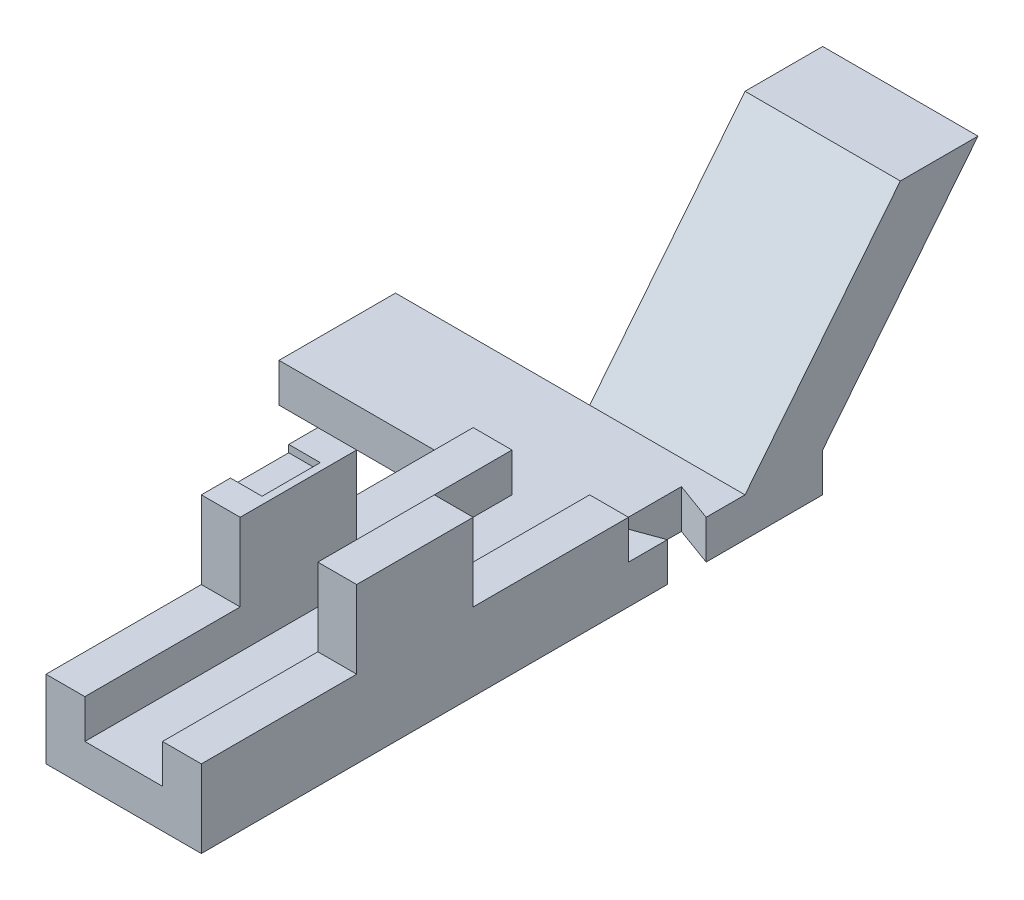
ISO-10303-21;
HEADER;
FILE_DESCRIPTION(('STEP AP214'),'2;1');
FILE_NAME('part.step','',(''),(''),'','','');
FILE_SCHEMA(('AUTOMOTIVE_DESIGN { 1 0 10303 214 1 1 1 1 }'));
ENDSEC;
DATA;
#1=APPLICATION_CONTEXT('core data for automotive mechanical design processes');
#2=APPLICATION_PROTOCOL_DEFINITION('international standard','automotive_design',2000,#1);
#3=PRODUCT_CONTEXT('',#1,'mechanical');
#4=PRODUCT('Part','Part','',(#3));
#5=PRODUCT_RELATED_PRODUCT_CATEGORY('part','',(#4));
#6=PRODUCT_DEFINITION_FORMATION('','',#4);
#7=PRODUCT_DEFINITION_CONTEXT('part definition',#1,'design');
#8=PRODUCT_DEFINITION('design','',#6,#7);
#9=PRODUCT_DEFINITION_SHAPE('','',#8);
#10=(LENGTH_UNIT() NAMED_UNIT(*) SI_UNIT(.MILLI.,.METRE.));
#11=(NAMED_UNIT(*) PLANE_ANGLE_UNIT() SI_UNIT($,.RADIAN.));
#12=(NAMED_UNIT(*) SI_UNIT($,.STERADIAN.) SOLID_ANGLE_UNIT());
#13=UNCERTAINTY_MEASURE_WITH_UNIT(LENGTH_MEASURE(1.E-05),#10,'distance_accuracy_value','');
#14=(GEOMETRIC_REPRESENTATION_CONTEXT(3) GLOBAL_UNCERTAINTY_ASSIGNED_CONTEXT((#13)) GLOBAL_UNIT_ASSIGNED_CONTEXT((#10,
#11,#12)) REPRESENTATION_CONTEXT('',''));
#15=CARTESIAN_POINT('',(0.,0.,0.));
#16=DIRECTION('',(0.,0.,1.));
#17=DIRECTION('',(1.,0.,0.));
#18=AXIS2_PLACEMENT_3D('',#15,#16,#17);
#19=CARTESIAN_POINT('',(101.6,25.4,0.));
#20=DIRECTION('',(-1.,0.,0.));
#21=DIRECTION('',(0.,0.,1.));
#22=AXIS2_PLACEMENT_3D('',#19,#20,#21);
#23=PLANE('',#22);
#24=DIRECTION('',(0.,0.,-1.));
#25=VECTOR('',#24,1.);
#26=CARTESIAN_POINT('',(101.6,0.,0.));
#27=LINE('',#26,#25);
#28=CARTESIAN_POINT('',(101.6,0.,0.));
#29=VERTEX_POINT('',#28);
#30=CARTESIAN_POINT('',(101.6,0.,-304.8));
#31=VERTEX_POINT('',#30);
#32=EDGE_CURVE('E501',#29,#31,#27,.T.);
#33=ORIENTED_EDGE('',*,*,#32,.T.);
#34=DIRECTION('',(0.,1.,0.));
#35=VECTOR('',#34,1.);
#36=CARTESIAN_POINT('',(101.6,-2.50000000007189E-05,-304.8));
#37=LINE('',#36,#35);
#38=CARTESIAN_POINT('',(101.6,25.4,-304.8));
#39=VERTEX_POINT('',#38);
#40=EDGE_CURVE('E342',#31,#39,#37,.T.);
#41=ORIENTED_EDGE('',*,*,#40,.T.);
#42=DIRECTION('',(0.,0.,-1.));
#43=VECTOR('',#42,1.);
#44=CARTESIAN_POINT('',(101.6,25.4,0.));
#45=LINE('',#44,#43);
#46=CARTESIAN_POINT('',(101.6,25.4,-279.4));
#47=VERTEX_POINT('',#46);
#48=EDGE_CURVE('E492',#47,#39,#45,.T.);
#49=ORIENTED_EDGE('',*,*,#48,.F.);
#50=DIRECTION('',(0.,-1.,0.));
#51=VECTOR('',#50,1.);
#52=CARTESIAN_POINT('',(101.6,50.8,-279.4));
#53=LINE('',#52,#51);
#54=CARTESIAN_POINT('',(101.6,50.8,-279.4));
#55=VERTEX_POINT('',#54);
#56=EDGE_CURVE('E606',#55,#47,#53,.T.);
#57=ORIENTED_EDGE('',*,*,#56,.F.);
#58=DIRECTION('',(0.,0.,1.));
#59=VECTOR('',#58,1.);
#60=CARTESIAN_POINT('',(101.6,50.8,-279.4));
#61=LINE('',#60,#59);
#62=CARTESIAN_POINT('',(101.6,50.8,-177.8));
#63=VERTEX_POINT('',#62);
#64=EDGE_CURVE('E597',#55,#63,#61,.T.);
#65=ORIENTED_EDGE('',*,*,#64,.T.);
#66=DIRECTION('',(0.,-1.,0.));
#67=VECTOR('',#66,1.);
#68=CARTESIAN_POINT('',(101.6,101.6,-177.8));
#69=LINE('',#68,#67);
#70=CARTESIAN_POINT('',(101.6,101.6,-177.8));
#71=VERTEX_POINT('',#70);
#72=EDGE_CURVE('E558',#71,#63,#69,.T.);
#73=ORIENTED_EDGE('',*,*,#72,.F.);
#74=DIRECTION('',(0.,0.,-1.));
#75=VECTOR('',#74,1.);
#76=CARTESIAN_POINT('',(101.6,101.6,-177.8));
#77=LINE('',#76,#75);
#78=CARTESIAN_POINT('',(101.6,101.6,-101.6));
#79=VERTEX_POINT('',#78);
#80=EDGE_CURVE('E547',#79,#71,#77,.T.);
#81=ORIENTED_EDGE('',*,*,#80,.F.);
#82=DIRECTION('',(0.,-1.,0.));
#83=VECTOR('',#82,1.);
#84=CARTESIAN_POINT('',(101.6,101.6,-101.6));
#85=LINE('',#84,#83);
#86=CARTESIAN_POINT('',(101.6,50.8,-101.6));
#87=VERTEX_POINT('',#86);
#88=EDGE_CURVE('E561',#79,#87,#85,.T.);
#89=ORIENTED_EDGE('',*,*,#88,.T.);
#90=CARTESIAN_POINT('',(101.6,50.8,0.));
#91=VERTEX_POINT('',#90);
#92=EDGE_CURVE('E595',#87,#91,#61,.T.);
#93=ORIENTED_EDGE('',*,*,#92,.T.);
#94=DIRECTION('',(0.,-1.,0.));
#95=VECTOR('',#94,1.);
#96=CARTESIAN_POINT('',(101.6,25.4,0.));
#97=LINE('',#96,#95);
#98=EDGE_CURVE('E515',#91,#29,#97,.T.);
#99=ORIENTED_EDGE('',*,*,#98,.T.);
#100=EDGE_LOOP('',(#33,#41,#49,#57,#65,#73,#81,#89,#93,#99));
#101=FACE_BOUND('',#100,.T.);
#102=ADVANCED_FACE('F90',(#101),#23,.F.);
#103=CARTESIAN_POINT('',(0.,25.4,-355.6));
#104=DIRECTION('',(0.,0.,1.));
#105=DIRECTION('',(1.,0.,0.));
#106=AXIS2_PLACEMENT_3D('',#103,#104,#105);
#107=PLANE('',#106);
#108=DIRECTION('',(0.,1.,0.));
#109=VECTOR('',#108,1.);
#110=CARTESIAN_POINT('',(0.,25.4,-355.6));
#111=LINE('',#110,#109);
#112=CARTESIAN_POINT('',(0.,0.,-355.6));
#113=VERTEX_POINT('',#112);
#114=CARTESIAN_POINT('',(0.,25.4,-355.6));
#115=VERTEX_POINT('',#114);
#116=EDGE_CURVE('E453',#113,#115,#111,.T.);
#117=ORIENTED_EDGE('',*,*,#116,.F.);
#118=DIRECTION('',(-1.,0.,0.));
#119=VECTOR('',#118,1.);
#120=CARTESIAN_POINT('',(0.,0.,-355.6));
#121=LINE('',#120,#119);
#122=CARTESIAN_POINT('',(-127.,0.,-355.6));
#123=VERTEX_POINT('',#122);
#124=EDGE_CURVE('E497',#113,#123,#121,.T.);
#125=ORIENTED_EDGE('',*,*,#124,.T.);
#126=DIRECTION('',(0.,-1.,0.));
#127=VECTOR('',#126,1.);
#128=CARTESIAN_POINT('',(-127.,25.4,-355.6));
#129=LINE('',#128,#127);
#130=CARTESIAN_POINT('',(-127.,25.4,-355.6));
#131=VERTEX_POINT('',#130);
#132=EDGE_CURVE('E654',#131,#123,#129,.T.);
#133=ORIENTED_EDGE('',*,*,#132,.F.);
#134=DIRECTION('',(-1.,0.,0.));
#135=VECTOR('',#134,1.);
#136=CARTESIAN_POINT('',(0.,25.4,-355.6));
#137=LINE('',#136,#135);
#138=EDGE_CURVE('E495',#115,#131,#137,.T.);
#139=ORIENTED_EDGE('',*,*,#138,.F.);
#140=EDGE_LOOP('',(#117,#125,#133,#139));
#141=FACE_BOUND('',#140,.T.);
#142=ADVANCED_FACE('F724',(#141),#107,.F.);
#143=CARTESIAN_POINT('',(0.,50.8,0.));
#144=DIRECTION('',(0.,-1.,0.));
#145=DIRECTION('',(0.,0.,-1.));
#146=AXIS2_PLACEMENT_3D('',#143,#144,#145);
#147=PLANE('',#146);
#148=DIRECTION('',(1.,0.,0.));
#149=VECTOR('',#148,1.);
#150=CARTESIAN_POINT('',(76.2,50.8,-101.6));
#151=LINE('',#150,#149);
#152=CARTESIAN_POINT('',(76.2,50.8,-101.6));
#153=VERTEX_POINT('',#152);
#154=EDGE_CURVE('E540',#153,#87,#151,.T.);
#155=ORIENTED_EDGE('',*,*,#154,.F.);
#156=DIRECTION('',(0.,0.,1.));
#157=VECTOR('',#156,1.);
#158=CARTESIAN_POINT('',(76.2,50.8,-279.4));
#159=LINE('',#158,#157);
#160=CARTESIAN_POINT('',(76.2,50.8,0.));
#161=VERTEX_POINT('',#160);
#162=EDGE_CURVE('E603',#153,#161,#159,.T.);
#163=ORIENTED_EDGE('',*,*,#162,.T.);
#164=DIRECTION('',(1.,0.,0.));
#165=VECTOR('',#164,1.);
#166=CARTESIAN_POINT('',(76.2,50.8,0.));
#167=LINE('',#166,#165);
#168=EDGE_CURVE('E600',#161,#91,#167,.T.);
#169=ORIENTED_EDGE('',*,*,#168,.T.);
#170=ORIENTED_EDGE('',*,*,#92,.F.);
#171=EDGE_LOOP('',(#155,#163,#169,#170));
#172=FACE_BOUND('',#171,.T.);
#173=ADVANCED_FACE('F722',(#172),#147,.F.);
#174=DIRECTION('',(-1.,0.,0.));
#175=VECTOR('',#174,1.);
#176=CARTESIAN_POINT('',(76.2,50.8,-177.8));
#177=LINE('',#176,#175);
#178=CARTESIAN_POINT('',(76.2,50.8,-177.8));
#179=VERTEX_POINT('',#178);
#180=EDGE_CURVE('E545',#63,#179,#177,.T.);
#181=ORIENTED_EDGE('',*,*,#180,.F.);
#182=ORIENTED_EDGE('',*,*,#64,.F.);
#183=DIRECTION('',(1.,0.,0.));
#184=VECTOR('',#183,1.);
#185=CARTESIAN_POINT('',(76.2,50.8,-279.4));
#186=LINE('',#185,#184);
#187=CARTESIAN_POINT('',(76.2,50.8,-279.4));
#188=VERTEX_POINT('',#187);
#189=EDGE_CURVE('E592',#188,#55,#186,.T.);
#190=ORIENTED_EDGE('',*,*,#189,.F.);
#191=EDGE_CURVE('E604',#188,#179,#159,.T.);
#192=ORIENTED_EDGE('',*,*,#191,.T.);
#193=EDGE_LOOP('',(#181,#182,#190,#192));
#194=FACE_BOUND('',#193,.T.);
#195=ADVANCED_FACE('F708',(#194),#147,.F.);
#196=CARTESIAN_POINT('',(0.,50.8,0.));
#197=DIRECTION('',(0.,1.,0.));
#198=DIRECTION('',(0.,0.,1.));
#199=AXIS2_PLACEMENT_3D('',#196,#197,#198);
#200=PLANE('',#199);
#201=DIRECTION('',(0.,0.,-1.));
#202=VECTOR('',#201,1.);
#203=CARTESIAN_POINT('',(25.4,50.8,-279.4));
#204=LINE('',#203,#202);
#205=CARTESIAN_POINT('',(25.4,50.8,0.));
#206=VERTEX_POINT('',#205);
#207=CARTESIAN_POINT('',(25.4,50.8,-101.6));
#208=VERTEX_POINT('',#207);
#209=EDGE_CURVE('E626',#206,#208,#204,.T.);
#210=ORIENTED_EDGE('',*,*,#209,.T.);
#211=DIRECTION('',(1.,0.,0.));
#212=VECTOR('',#211,1.);
#213=CARTESIAN_POINT('',(0.,50.8,-101.6));
#214=LINE('',#213,#212);
#215=CARTESIAN_POINT('',(0.,50.8,-101.6));
#216=VERTEX_POINT('',#215);
#217=EDGE_CURVE('E567',#216,#208,#214,.T.);
#218=ORIENTED_EDGE('',*,*,#217,.F.);
#219=DIRECTION('',(0.,0.,1.));
#220=VECTOR('',#219,1.);
#221=CARTESIAN_POINT('',(0.,50.8,-279.4));
#222=LINE('',#221,#220);
#223=CARTESIAN_POINT('',(0.,50.8,0.));
#224=VERTEX_POINT('',#223);
#225=EDGE_CURVE('E623',#216,#224,#222,.T.);
#226=ORIENTED_EDGE('',*,*,#225,.T.);
#227=DIRECTION('',(1.,0.,0.));
#228=VECTOR('',#227,1.);
#229=CARTESIAN_POINT('',(0.,50.8,0.));
#230=LINE('',#229,#228);
#231=EDGE_CURVE('E622',#224,#206,#230,.T.);
#232=ORIENTED_EDGE('',*,*,#231,.T.);
#233=EDGE_LOOP('',(#210,#218,#226,#232));
#234=FACE_BOUND('',#233,.T.);
#235=ADVANCED_FACE('F730',(#234),#200,.T.);
#236=CARTESIAN_POINT('',(0.,50.8,-279.4));
#237=VERTEX_POINT('',#236);
#238=CARTESIAN_POINT('',(0.,50.8,-177.8));
#239=VERTEX_POINT('',#238);
#240=EDGE_CURVE('E619',#237,#239,#222,.T.);
#241=ORIENTED_EDGE('',*,*,#240,.T.);
#242=DIRECTION('',(-1.,0.,0.));
#243=VECTOR('',#242,1.);
#244=CARTESIAN_POINT('',(0.,50.8,-177.8));
#245=LINE('',#244,#243);
#246=CARTESIAN_POINT('',(25.4,50.8,-177.8));
#247=VERTEX_POINT('',#246);
#248=EDGE_CURVE('E580',#247,#239,#245,.T.);
#249=ORIENTED_EDGE('',*,*,#248,.F.);
#250=CARTESIAN_POINT('',(25.4,50.8,-279.4));
#251=VERTEX_POINT('',#250);
#252=EDGE_CURVE('E625',#247,#251,#204,.T.);
#253=ORIENTED_EDGE('',*,*,#252,.T.);
#254=DIRECTION('',(-1.,0.,0.));
#255=VECTOR('',#254,1.);
#256=CARTESIAN_POINT('',(0.,50.8,-279.4));
#257=LINE('',#256,#255);
#258=EDGE_CURVE('E629',#251,#237,#257,.T.);
#259=ORIENTED_EDGE('',*,*,#258,.T.);
#260=EDGE_LOOP('',(#241,#249,#253,#259));
#261=FACE_BOUND('',#260,.T.);
#262=ADVANCED_FACE('F680',(#261),#200,.T.);
#263=CARTESIAN_POINT('',(0.,25.4,0.));
#264=DIRECTION('',(0.,-1.,0.));
#265=DIRECTION('',(0.,0.,-1.));
#266=AXIS2_PLACEMENT_3D('',#263,#264,#265);
#267=PLANE('',#266);
#268=ORIENTED_EDGE('',*,*,#48,.T.);
#269=DIRECTION('',(0.939692620785907,0.,-0.342020143325672));
#270=VECTOR('',#269,1.);
#271=CARTESIAN_POINT('',(101.6,25.4,-304.8));
#272=LINE('',#271,#270);
#273=CARTESIAN_POINT('',(76.1281368442361,25.4,-295.529));
#274=VERTEX_POINT('',#273);
#275=EDGE_CURVE('E331',#274,#39,#272,.T.);
#276=ORIENTED_EDGE('',*,*,#275,.F.);
#277=DIRECTION('',(0.,0.,1.));
#278=VECTOR('',#277,1.);
#279=CARTESIAN_POINT('',(76.1281368442361,25.4,-295.529));
#280=LINE('',#279,#278);
#281=CARTESIAN_POINT('',(76.1281368442361,25.4,-339.471));
#282=VERTEX_POINT('',#281);
#283=EDGE_CURVE('E339',#282,#274,#280,.T.);
#284=ORIENTED_EDGE('',*,*,#283,.F.);
#285=DIRECTION('',(-0.93969262078591,0.,-0.342020143325663));
#286=VECTOR('',#285,1.);
#287=CARTESIAN_POINT('',(101.6,25.4,-330.2));
#288=LINE('',#287,#286);
#289=CARTESIAN_POINT('',(101.6,25.4,-330.2));
#290=VERTEX_POINT('',#289);
#291=EDGE_CURVE('E337',#290,#282,#288,.T.);
#292=ORIENTED_EDGE('',*,*,#291,.F.);
#293=CARTESIAN_POINT('',(101.6,25.4,-355.6));
#294=VERTEX_POINT('',#293);
#295=EDGE_CURVE('E94',#290,#294,#45,.T.);
#296=ORIENTED_EDGE('',*,*,#295,.T.);
#297=DIRECTION('',(1.,0.,0.));
#298=VECTOR('',#297,1.);
#299=CARTESIAN_POINT('',(0.,25.4,-355.6));
#300=LINE('',#299,#298);
#301=EDGE_CURVE('E345',#115,#294,#300,.T.);
#302=ORIENTED_EDGE('',*,*,#301,.F.);
#303=ORIENTED_EDGE('',*,*,#138,.T.);
#304=DIRECTION('',(0.,0.,1.));
#305=VECTOR('',#304,1.);
#306=CARTESIAN_POINT('',(-127.,25.4,-355.6));
#307=LINE('',#306,#305);
#308=CARTESIAN_POINT('',(-127.,25.4,-279.4));
#309=VERTEX_POINT('',#308);
#310=EDGE_CURVE('E646',#131,#309,#307,.T.);
#311=ORIENTED_EDGE('',*,*,#310,.T.);
#312=DIRECTION('',(1.,0.,0.));
#313=VECTOR('',#312,1.);
#314=CARTESIAN_POINT('',(-127.,25.4,-279.4));
#315=LINE('',#314,#313);
#316=CARTESIAN_POINT('',(0.,25.4,-279.4));
#317=VERTEX_POINT('',#316);
#318=EDGE_CURVE('E504',#309,#317,#315,.T.);
#319=ORIENTED_EDGE('',*,*,#318,.T.);
#320=DIRECTION('',(-1.,0.,0.));
#321=VECTOR('',#320,1.);
#322=CARTESIAN_POINT('',(0.,25.4,-279.4));
#323=LINE('',#322,#321);
#324=CARTESIAN_POINT('',(25.4,25.4,-279.4));
#325=VERTEX_POINT('',#324);
#326=EDGE_CURVE('E634',#325,#317,#323,.T.);
#327=ORIENTED_EDGE('',*,*,#326,.F.);
#328=DIRECTION('',(0.,0.,-1.));
#329=VECTOR('',#328,1.);
#330=CARTESIAN_POINT('',(25.4,25.4,-279.4));
#331=LINE('',#330,#329);
#332=CARTESIAN_POINT('',(25.4,25.4,0.));
#333=VERTEX_POINT('',#332);
#334=EDGE_CURVE('E613',#333,#325,#331,.T.);
#335=ORIENTED_EDGE('',*,*,#334,.F.);
#336=DIRECTION('',(1.,0.,0.));
#337=VECTOR('',#336,1.);
#338=CARTESIAN_POINT('',(0.,25.4,0.));
#339=LINE('',#338,#337);
#340=CARTESIAN_POINT('',(76.2,25.4,0.));
#341=VERTEX_POINT('',#340);
#342=EDGE_CURVE('E493',#333,#341,#339,.T.);
#343=ORIENTED_EDGE('',*,*,#342,.T.);
#344=DIRECTION('',(0.,0.,1.));
#345=VECTOR('',#344,1.);
#346=CARTESIAN_POINT('',(76.2,25.4,-279.4));
#347=LINE('',#346,#345);
#348=CARTESIAN_POINT('',(76.2,25.4,-279.4));
#349=VERTEX_POINT('',#348);
#350=EDGE_CURVE('E596',#349,#341,#347,.T.);
#351=ORIENTED_EDGE('',*,*,#350,.F.);
#352=DIRECTION('',(1.,0.,0.));
#353=VECTOR('',#352,1.);
#354=CARTESIAN_POINT('',(76.2,25.4,-279.4));
#355=LINE('',#354,#353);
#356=EDGE_CURVE('E591',#349,#47,#355,.T.);
#357=ORIENTED_EDGE('',*,*,#356,.T.);
#358=EDGE_LOOP('',(#268,#276,#284,#292,#296,#302,#303,#311,#319,#327,#335,#343,#351,#357));
#359=FACE_BOUND('',#358,.T.);
#360=ADVANCED_FACE('F663',(#359),#267,.F.);
#361=CARTESIAN_POINT('',(0.,25.4,0.));
#362=DIRECTION('',(1.,0.,0.));
#363=DIRECTION('',(0.,0.,-1.));
#364=AXIS2_PLACEMENT_3D('',#361,#362,#363);
#365=PLANE('',#364);
#366=DIRECTION('',(0.,0.,1.));
#367=VECTOR('',#366,1.);
#368=CARTESIAN_POINT('',(0.,101.6,-177.8));
#369=LINE('',#368,#367);
#370=CARTESIAN_POINT('',(0.,101.6,-120.65));
#371=VERTEX_POINT('',#370);
#372=CARTESIAN_POINT('',(0.,101.6,-101.6));
#373=VERTEX_POINT('',#372);
#374=EDGE_CURVE('E572',#371,#373,#369,.T.);
#375=ORIENTED_EDGE('',*,*,#374,.F.);
#376=DIRECTION('',(0.,1.,0.));
#377=VECTOR('',#376,1.);
#378=CARTESIAN_POINT('',(0.,96.8502,-120.65));
#379=LINE('',#378,#377);
#380=CARTESIAN_POINT('',(0.,96.8502,-120.65));
#381=VERTEX_POINT('',#380);
#382=EDGE_CURVE('E329',#381,#371,#379,.T.);
#383=ORIENTED_EDGE('',*,*,#382,.F.);
#384=DIRECTION('',(0.,0.,1.));
#385=VECTOR('',#384,1.);
#386=CARTESIAN_POINT('',(0.,96.8502,-120.65));
#387=LINE('',#386,#385);
#388=CARTESIAN_POINT('',(0.,96.8502,-158.75));
#389=VERTEX_POINT('',#388);
#390=EDGE_CURVE('E307',#389,#381,#387,.T.);
#391=ORIENTED_EDGE('',*,*,#390,.F.);
#392=DIRECTION('',(0.,1.,0.));
#393=VECTOR('',#392,1.);
#394=CARTESIAN_POINT('',(0.,96.8502,-158.75));
#395=LINE('',#394,#393);
#396=CARTESIAN_POINT('',(0.,101.6,-158.75));
#397=VERTEX_POINT('',#396);
#398=EDGE_CURVE('E332',#389,#397,#395,.T.);
#399=ORIENTED_EDGE('',*,*,#398,.T.);
#400=CARTESIAN_POINT('',(0.,101.6,-177.8));
#401=VERTEX_POINT('',#400);
#402=EDGE_CURVE('E568',#401,#397,#369,.T.);
#403=ORIENTED_EDGE('',*,*,#402,.F.);
#404=DIRECTION('',(0.,-1.,0.));
#405=VECTOR('',#404,1.);
#406=CARTESIAN_POINT('',(0.,101.6,-177.8));
#407=LINE('',#406,#405);
#408=EDGE_CURVE('E578',#401,#239,#407,.T.);
#409=ORIENTED_EDGE('',*,*,#408,.T.);
#410=ORIENTED_EDGE('',*,*,#240,.F.);
#411=DIRECTION('',(0.,-1.,0.));
#412=VECTOR('',#411,1.);
#413=CARTESIAN_POINT('',(0.,50.8,-279.4));
#414=LINE('',#413,#412);
#415=EDGE_CURVE('E631',#237,#317,#414,.T.);
#416=ORIENTED_EDGE('',*,*,#415,.T.);
#417=DIRECTION('',(0.,-1.,0.));
#418=VECTOR('',#417,1.);
#419=CARTESIAN_POINT('',(0.,25.4,-279.4));
#420=LINE('',#419,#418);
#421=CARTESIAN_POINT('',(0.,0.,-279.4));
#422=VERTEX_POINT('',#421);
#423=EDGE_CURVE('E645',#317,#422,#420,.T.);
#424=ORIENTED_EDGE('',*,*,#423,.T.);
#425=DIRECTION('',(0.,0.,1.));
#426=VECTOR('',#425,1.);
#427=CARTESIAN_POINT('',(0.,0.,0.));
#428=LINE('',#427,#426);
#429=CARTESIAN_POINT('',(0.,0.,0.));
#430=VERTEX_POINT('',#429);
#431=EDGE_CURVE('E508',#422,#430,#428,.T.);
#432=ORIENTED_EDGE('',*,*,#431,.T.);
#433=DIRECTION('',(0.,-1.,0.));
#434=VECTOR('',#433,1.);
#435=CARTESIAN_POINT('',(0.,25.4,0.));
#436=LINE('',#435,#434);
#437=EDGE_CURVE('E477',#224,#430,#436,.T.);
#438=ORIENTED_EDGE('',*,*,#437,.F.);
#439=ORIENTED_EDGE('',*,*,#225,.F.);
#440=DIRECTION('',(0.,-1.,0.));
#441=VECTOR('',#440,1.);
#442=CARTESIAN_POINT('',(0.,101.6,-101.6));
#443=LINE('',#442,#441);
#444=EDGE_CURVE('E589',#373,#216,#443,.T.);
#445=ORIENTED_EDGE('',*,*,#444,.F.);
#446=EDGE_LOOP('',(#375,#383,#391,#399,#403,#409,#410,#416,#424,#432,#438,#439,#445));
#447=FACE_BOUND('',#446,.T.);
#448=ADVANCED_FACE('F92',(#447),#365,.F.);
#449=CARTESIAN_POINT('',(0.,25.4,0.));
#450=DIRECTION('',(0.,0.,-1.));
#451=DIRECTION('',(-1.,0.,0.));
#452=AXIS2_PLACEMENT_3D('',#449,#450,#451);
#453=PLANE('',#452);
#454=DIRECTION('',(1.,0.,0.));
#455=VECTOR('',#454,1.);
#456=CARTESIAN_POINT('',(0.,0.,0.));
#457=LINE('',#456,#455);
#458=EDGE_CURVE('E662',#430,#29,#457,.T.);
#459=ORIENTED_EDGE('',*,*,#458,.T.);
#460=ORIENTED_EDGE('',*,*,#98,.F.);
#461=ORIENTED_EDGE('',*,*,#168,.F.);
#462=DIRECTION('',(0.,-1.,0.));
#463=VECTOR('',#462,1.);
#464=CARTESIAN_POINT('',(76.2,50.8,0.));
#465=LINE('',#464,#463);
#466=EDGE_CURVE('E614',#161,#341,#465,.T.);
#467=ORIENTED_EDGE('',*,*,#466,.T.);
#468=ORIENTED_EDGE('',*,*,#342,.F.);
#469=DIRECTION('',(0.,-1.,0.));
#470=VECTOR('',#469,1.);
#471=CARTESIAN_POINT('',(25.4,50.8,0.));
#472=LINE('',#471,#470);
#473=EDGE_CURVE('E642',#206,#333,#472,.T.);
#474=ORIENTED_EDGE('',*,*,#473,.F.);
#475=ORIENTED_EDGE('',*,*,#231,.F.);
#476=ORIENTED_EDGE('',*,*,#437,.T.);
#477=EDGE_LOOP('',(#459,#460,#461,#467,#468,#474,#475,#476));
#478=FACE_BOUND('',#477,.T.);
#479=ADVANCED_FACE('F688',(#478),#453,.F.);
#480=ORIENTED_EDGE('',*,*,#295,.F.);
#481=DIRECTION('',(0.,1.,0.));
#482=VECTOR('',#481,1.);
#483=CARTESIAN_POINT('',(101.6,-2.50000000007189E-05,-330.2));
#484=LINE('',#483,#482);
#485=CARTESIAN_POINT('',(101.6,0.,-330.2));
#486=VERTEX_POINT('',#485);
#487=EDGE_CURVE('E347',#486,#290,#484,.T.);
#488=ORIENTED_EDGE('',*,*,#487,.F.);
#489=CARTESIAN_POINT('',(101.6,0.,-406.4));
#490=VERTEX_POINT('',#489);
#491=EDGE_CURVE('E488',#486,#490,#27,.T.);
#492=ORIENTED_EDGE('',*,*,#491,.T.);
#493=DIRECTION('',(0.,-1.,0.));
#494=VECTOR('',#493,1.);
#495=CARTESIAN_POINT('',(101.6,25.4,-406.4));
#496=LINE('',#495,#494);
#497=CARTESIAN_POINT('',(101.6,25.4,-406.4));
#498=VERTEX_POINT('',#497);
#499=EDGE_CURVE('E520',#498,#490,#496,.T.);
#500=ORIENTED_EDGE('',*,*,#499,.F.);
#501=CARTESIAN_POINT('',(101.6,25.4,-406.4));
#502=CARTESIAN_POINT('',(101.6,67.7333333333333,-440.266899010395));
#503=CARTESIAN_POINT('',(101.6,110.066666666667,-474.133798020789));
#504=CARTESIAN_POINT('',(101.6,152.4,-508.000697031184));
#505=B_SPLINE_CURVE_WITH_KNOTS('',3,(#501,#502,#503,#504),.UNSPECIFIED.,.F.,.F.,(4,4),(0.,1.),.UNSPECIFIED.);
#506=CARTESIAN_POINT('',(101.6,152.4,-508.000697031184));
#507=VERTEX_POINT('',#506);
#508=EDGE_CURVE('E351',#498,#507,#505,.T.);
#509=ORIENTED_EDGE('',*,*,#508,.T.);
#510=DIRECTION('',(0.,0.,-1.));
#511=VECTOR('',#510,1.);
#512=CARTESIAN_POINT('',(101.6,152.4,-508.000697031184));
#513=LINE('',#512,#511);
#514=CARTESIAN_POINT('',(101.6,152.4,-457.200697031184));
#515=VERTEX_POINT('',#514);
#516=EDGE_CURVE('E396',#515,#507,#513,.T.);
#517=ORIENTED_EDGE('',*,*,#516,.F.);
#518=CARTESIAN_POINT('',(101.6,25.4,-355.6));
#519=CARTESIAN_POINT('',(101.6,67.7333333333333,-389.466899010395));
#520=CARTESIAN_POINT('',(101.6,110.066666666667,-423.333798020789));
#521=CARTESIAN_POINT('',(101.6,152.4,-457.200697031184));
#522=B_SPLINE_CURVE_WITH_KNOTS('',3,(#518,#519,#520,#521),.UNSPECIFIED.,.F.,.F.,(4,4),(0.,1.),.UNSPECIFIED.);
#523=EDGE_CURVE('E354',#294,#515,#522,.T.);
#524=ORIENTED_EDGE('',*,*,#523,.F.);
#525=EDGE_LOOP('',(#480,#488,#492,#500,#509,#517,#524));
#526=FACE_BOUND('',#525,.T.);
#527=ADVANCED_FACE('F459',(#526),#23,.F.);
#528=CARTESIAN_POINT('',(0.,0.,0.));
#529=DIRECTION('',(0.,-1.,0.));
#530=DIRECTION('',(0.,0.,-1.));
#531=AXIS2_PLACEMENT_3D('',#528,#529,#530);
#532=PLANE('',#531);
#533=DIRECTION('',(-0.939692620785907,0.,0.342020143325672));
#534=VECTOR('',#533,1.);
#535=CARTESIAN_POINT('',(-86.0758894266733,0.,-236.491562559255));
#536=LINE('',#535,#534);
#537=CARTESIAN_POINT('',(76.1281368442361,0.,-295.529));
#538=VERTEX_POINT('',#537);
#539=EDGE_CURVE('E13',#31,#538,#536,.T.);
#540=ORIENTED_EDGE('',*,*,#539,.F.);
#541=ORIENTED_EDGE('',*,*,#32,.F.);
#542=ORIENTED_EDGE('',*,*,#458,.F.);
#543=ORIENTED_EDGE('',*,*,#431,.F.);
#544=DIRECTION('',(1.,0.,0.));
#545=VECTOR('',#544,1.);
#546=CARTESIAN_POINT('',(-127.,0.,-279.4));
#547=LINE('',#546,#545);
#548=CARTESIAN_POINT('',(-127.,0.,-279.4));
#549=VERTEX_POINT('',#548);
#550=EDGE_CURVE('E658',#549,#422,#547,.T.);
#551=ORIENTED_EDGE('',*,*,#550,.F.);
#552=DIRECTION('',(0.,0.,1.));
#553=VECTOR('',#552,1.);
#554=CARTESIAN_POINT('',(-127.,0.,-355.6));
#555=LINE('',#554,#553);
#556=EDGE_CURVE('E652',#123,#549,#555,.T.);
#557=ORIENTED_EDGE('',*,*,#556,.F.);
#558=ORIENTED_EDGE('',*,*,#124,.F.);
#559=DIRECTION('',(0.,0.,1.));
#560=VECTOR('',#559,1.);
#561=CARTESIAN_POINT('',(0.,0.,-406.4));
#562=LINE('',#561,#560);
#563=CARTESIAN_POINT('',(0.,0.,-406.4));
#564=VERTEX_POINT('',#563);
#565=EDGE_CURVE('E530',#564,#113,#562,.T.);
#566=ORIENTED_EDGE('',*,*,#565,.F.);
#567=DIRECTION('',(-1.,0.,0.));
#568=VECTOR('',#567,1.);
#569=CARTESIAN_POINT('',(101.6,0.,-406.4));
#570=LINE('',#569,#568);
#571=EDGE_CURVE('E524',#490,#564,#570,.T.);
#572=ORIENTED_EDGE('',*,*,#571,.F.);
#573=ORIENTED_EDGE('',*,*,#491,.F.);
#574=DIRECTION('',(0.93969262078591,0.,0.342020143325663));
#575=VECTOR('',#574,1.);
#576=CARTESIAN_POINT('',(118.009176648802,0.,-324.22754813102));
#577=LINE('',#576,#575);
#578=CARTESIAN_POINT('',(76.1281368442361,0.,-339.471));
#579=VERTEX_POINT('',#578);
#580=EDGE_CURVE('E475',#579,#486,#577,.T.);
#581=ORIENTED_EDGE('',*,*,#580,.F.);
#582=DIRECTION('',(0.,0.,-1.));
#583=VECTOR('',#582,1.);
#584=CARTESIAN_POINT('',(76.1281368442361,0.,0.));
#585=LINE('',#584,#583);
#586=EDGE_CURVE('E100',#538,#579,#585,.T.);
#587=ORIENTED_EDGE('',*,*,#586,.F.);
#588=EDGE_LOOP('',(#540,#541,#542,#543,#551,#557,#558,#566,#572,#573,#581,#587));
#589=FACE_BOUND('',#588,.T.);
#590=ADVANCED_FACE('F486',(#589),#532,.T.);
#591=CARTESIAN_POINT('',(-127.,25.4,-279.4));
#592=DIRECTION('',(0.,0.,1.));
#593=DIRECTION('',(1.,0.,0.));
#594=AXIS2_PLACEMENT_3D('',#591,#592,#593);
#595=PLANE('',#594);
#596=ORIENTED_EDGE('',*,*,#423,.F.);
#597=ORIENTED_EDGE('',*,*,#318,.F.);
#598=DIRECTION('',(0.,-1.,0.));
#599=VECTOR('',#598,1.);
#600=CARTESIAN_POINT('',(-127.,25.4,-279.4));
#601=LINE('',#600,#599);
#602=EDGE_CURVE('E649',#309,#549,#601,.T.);
#603=ORIENTED_EDGE('',*,*,#602,.T.);
#604=ORIENTED_EDGE('',*,*,#550,.T.);
#605=EDGE_LOOP('',(#596,#597,#603,#604));
#606=FACE_BOUND('',#605,.T.);
#607=ADVANCED_FACE('F666',(#606),#595,.T.);
#608=CARTESIAN_POINT('',(-127.,0.,0.));
#609=DIRECTION('',(1.,0.,0.));
#610=DIRECTION('',(0.,0.,-1.));
#611=AXIS2_PLACEMENT_3D('',#608,#609,#610);
#612=PLANE('',#611);
#613=ORIENTED_EDGE('',*,*,#310,.F.);
#614=ORIENTED_EDGE('',*,*,#132,.T.);
#615=ORIENTED_EDGE('',*,*,#556,.T.);
#616=ORIENTED_EDGE('',*,*,#602,.F.);
#617=EDGE_LOOP('',(#613,#614,#615,#616));
#618=FACE_BOUND('',#617,.T.);
#619=ADVANCED_FACE('F760',(#618),#612,.F.);
#620=CARTESIAN_POINT('',(25.4,50.8,-279.4));
#621=DIRECTION('',(-1.,0.,0.));
#622=DIRECTION('',(0.,0.,1.));
#623=AXIS2_PLACEMENT_3D('',#620,#621,#622);
#624=PLANE('',#623);
#625=ORIENTED_EDGE('',*,*,#334,.T.);
#626=DIRECTION('',(0.,-1.,0.));
#627=VECTOR('',#626,1.);
#628=CARTESIAN_POINT('',(25.4,50.8,-279.4));
#629=LINE('',#628,#627);
#630=EDGE_CURVE('E639',#251,#325,#629,.T.);
#631=ORIENTED_EDGE('',*,*,#630,.F.);
#632=ORIENTED_EDGE('',*,*,#252,.F.);
#633=DIRECTION('',(0.,-1.,0.));
#634=VECTOR('',#633,1.);
#635=CARTESIAN_POINT('',(25.4,101.6,-177.8));
#636=LINE('',#635,#634);
#637=CARTESIAN_POINT('',(25.4,101.6,-177.8));
#638=VERTEX_POINT('',#637);
#639=EDGE_CURVE('E584',#638,#247,#636,.T.);
#640=ORIENTED_EDGE('',*,*,#639,.F.);
#641=DIRECTION('',(0.,0.,-1.));
#642=VECTOR('',#641,1.);
#643=CARTESIAN_POINT('',(25.4,101.6,-177.8));
#644=LINE('',#643,#642);
#645=CARTESIAN_POINT('',(25.4,101.6,-101.6));
#646=VERTEX_POINT('',#645);
#647=EDGE_CURVE('E574',#646,#638,#644,.T.);
#648=ORIENTED_EDGE('',*,*,#647,.F.);
#649=DIRECTION('',(0.,-1.,0.));
#650=VECTOR('',#649,1.);
#651=CARTESIAN_POINT('',(25.4,101.6,-101.6));
#652=LINE('',#651,#650);
#653=EDGE_CURVE('E586',#646,#208,#652,.T.);
#654=ORIENTED_EDGE('',*,*,#653,.T.);
#655=ORIENTED_EDGE('',*,*,#209,.F.);
#656=ORIENTED_EDGE('',*,*,#473,.T.);
#657=EDGE_LOOP('',(#625,#631,#632,#640,#648,#654,#655,#656));
#658=FACE_BOUND('',#657,.T.);
#659=ADVANCED_FACE('F684',(#658),#624,.F.);
#660=CARTESIAN_POINT('',(0.,50.8,-279.4));
#661=DIRECTION('',(0.,0.,1.));
#662=DIRECTION('',(1.,0.,0.));
#663=AXIS2_PLACEMENT_3D('',#660,#661,#662);
#664=PLANE('',#663);
#665=ORIENTED_EDGE('',*,*,#326,.T.);
#666=ORIENTED_EDGE('',*,*,#415,.F.);
#667=ORIENTED_EDGE('',*,*,#258,.F.);
#668=ORIENTED_EDGE('',*,*,#630,.T.);
#669=EDGE_LOOP('',(#665,#666,#667,#668));
#670=FACE_BOUND('',#669,.T.);
#671=ADVANCED_FACE('F671',(#670),#664,.F.);
#672=CARTESIAN_POINT('',(76.2,50.8,-279.4));
#673=DIRECTION('',(0.,0.,-1.));
#674=DIRECTION('',(-1.,0.,0.));
#675=AXIS2_PLACEMENT_3D('',#672,#673,#674);
#676=PLANE('',#675);
#677=ORIENTED_EDGE('',*,*,#356,.F.);
#678=DIRECTION('',(0.,-1.,0.));
#679=VECTOR('',#678,1.);
#680=CARTESIAN_POINT('',(76.2,50.8,-279.4));
#681=LINE('',#680,#679);
#682=EDGE_CURVE('E610',#188,#349,#681,.T.);
#683=ORIENTED_EDGE('',*,*,#682,.F.);
#684=ORIENTED_EDGE('',*,*,#189,.T.);
#685=ORIENTED_EDGE('',*,*,#56,.T.);
#686=EDGE_LOOP('',(#677,#683,#684,#685));
#687=FACE_BOUND('',#686,.T.);
#688=ADVANCED_FACE('F701',(#687),#676,.T.);
#689=CARTESIAN_POINT('',(76.2,50.8,-279.4));
#690=DIRECTION('',(1.,0.,0.));
#691=DIRECTION('',(0.,0.,-1.));
#692=AXIS2_PLACEMENT_3D('',#689,#690,#691);
#693=PLANE('',#692);
#694=ORIENTED_EDGE('',*,*,#350,.T.);
#695=ORIENTED_EDGE('',*,*,#466,.F.);
#696=ORIENTED_EDGE('',*,*,#162,.F.);
#697=DIRECTION('',(0.,-1.,0.));
#698=VECTOR('',#697,1.);
#699=CARTESIAN_POINT('',(76.2,101.6,-101.6));
#700=LINE('',#699,#698);
#701=CARTESIAN_POINT('',(76.2,101.6,-101.6));
#702=VERTEX_POINT('',#701);
#703=EDGE_CURVE('E564',#702,#153,#700,.T.);
#704=ORIENTED_EDGE('',*,*,#703,.F.);
#705=DIRECTION('',(0.,0.,1.));
#706=VECTOR('',#705,1.);
#707=CARTESIAN_POINT('',(76.2,101.6,-177.8));
#708=LINE('',#707,#706);
#709=CARTESIAN_POINT('',(76.2,101.6,-177.8));
#710=VERTEX_POINT('',#709);
#711=EDGE_CURVE('E541',#710,#702,#708,.T.);
#712=ORIENTED_EDGE('',*,*,#711,.F.);
#713=DIRECTION('',(0.,-1.,0.));
#714=VECTOR('',#713,1.);
#715=CARTESIAN_POINT('',(76.2,101.6,-177.8));
#716=LINE('',#715,#714);
#717=EDGE_CURVE('E551',#710,#179,#716,.T.);
#718=ORIENTED_EDGE('',*,*,#717,.T.);
#719=ORIENTED_EDGE('',*,*,#191,.F.);
#720=ORIENTED_EDGE('',*,*,#682,.T.);
#721=EDGE_LOOP('',(#694,#695,#696,#704,#712,#718,#719,#720));
#722=FACE_BOUND('',#721,.T.);
#723=ADVANCED_FACE('F695',(#722),#693,.F.);
#724=CARTESIAN_POINT('',(0.,101.6,-101.6));
#725=DIRECTION('',(0.,0.,-1.));
#726=DIRECTION('',(-1.,0.,0.));
#727=AXIS2_PLACEMENT_3D('',#724,#725,#726);
#728=PLANE('',#727);
#729=ORIENTED_EDGE('',*,*,#217,.T.);
#730=ORIENTED_EDGE('',*,*,#653,.F.);
#731=DIRECTION('',(1.,0.,0.));
#732=VECTOR('',#731,1.);
#733=CARTESIAN_POINT('',(0.,101.6,-101.6));
#734=LINE('',#733,#732);
#735=EDGE_CURVE('E571',#373,#646,#734,.T.);
#736=ORIENTED_EDGE('',*,*,#735,.F.);
#737=ORIENTED_EDGE('',*,*,#444,.T.);
#738=EDGE_LOOP('',(#729,#730,#736,#737));
#739=FACE_BOUND('',#738,.T.);
#740=ADVANCED_FACE('F772',(#739),#728,.F.);
#741=CARTESIAN_POINT('',(0.,101.6,-177.8));
#742=DIRECTION('',(0.,0.,1.));
#743=DIRECTION('',(1.,0.,0.));
#744=AXIS2_PLACEMENT_3D('',#741,#742,#743);
#745=PLANE('',#744);
#746=ORIENTED_EDGE('',*,*,#248,.T.);
#747=ORIENTED_EDGE('',*,*,#408,.F.);
#748=DIRECTION('',(-1.,0.,0.));
#749=VECTOR('',#748,1.);
#750=CARTESIAN_POINT('',(0.,101.6,-177.8));
#751=LINE('',#750,#749);
#752=EDGE_CURVE('E576',#638,#401,#751,.T.);
#753=ORIENTED_EDGE('',*,*,#752,.F.);
#754=ORIENTED_EDGE('',*,*,#639,.T.);
#755=EDGE_LOOP('',(#746,#747,#753,#754));
#756=FACE_BOUND('',#755,.T.);
#757=ADVANCED_FACE('F776',(#756),#745,.F.);
#758=CARTESIAN_POINT('',(0.,101.6,0.));
#759=DIRECTION('',(0.,1.,0.));
#760=DIRECTION('',(0.,0.,1.));
#761=AXIS2_PLACEMENT_3D('',#758,#759,#760);
#762=PLANE('',#761);
#763=DIRECTION('',(1.,0.,0.));
#764=VECTOR('',#763,1.);
#765=CARTESIAN_POINT('',(0.,101.6,-120.65));
#766=LINE('',#765,#764);
#767=CARTESIAN_POINT('',(20.6502,101.6,-120.65));
#768=VERTEX_POINT('',#767);
#769=EDGE_CURVE('E107',#371,#768,#766,.T.);
#770=ORIENTED_EDGE('',*,*,#769,.F.);
#771=ORIENTED_EDGE('',*,*,#374,.T.);
#772=ORIENTED_EDGE('',*,*,#735,.T.);
#773=ORIENTED_EDGE('',*,*,#647,.T.);
#774=ORIENTED_EDGE('',*,*,#752,.T.);
#775=ORIENTED_EDGE('',*,*,#402,.T.);
#776=DIRECTION('',(-1.,0.,0.));
#777=VECTOR('',#776,1.);
#778=CARTESIAN_POINT('',(0.,101.6,-158.75));
#779=LINE('',#778,#777);
#780=CARTESIAN_POINT('',(20.6502,101.6,-158.75));
#781=VERTEX_POINT('',#780);
#782=EDGE_CURVE('E320',#781,#397,#779,.T.);
#783=ORIENTED_EDGE('',*,*,#782,.F.);
#784=DIRECTION('',(0.,0.,-1.));
#785=VECTOR('',#784,1.);
#786=CARTESIAN_POINT('',(20.6502,101.6,-120.65));
#787=LINE('',#786,#785);
#788=EDGE_CURVE('E322',#768,#781,#787,.T.);
#789=ORIENTED_EDGE('',*,*,#788,.F.);
#790=EDGE_LOOP('',(#770,#771,#772,#773,#774,#775,#783,#789));
#791=FACE_BOUND('',#790,.T.);
#792=ADVANCED_FACE('F781',(#791),#762,.T.);
#793=CARTESIAN_POINT('',(76.2,101.6,-101.6));
#794=DIRECTION('',(0.,0.,-1.));
#795=DIRECTION('',(-1.,0.,0.));
#796=AXIS2_PLACEMENT_3D('',#793,#794,#795);
#797=PLANE('',#796);
#798=ORIENTED_EDGE('',*,*,#154,.T.);
#799=ORIENTED_EDGE('',*,*,#88,.F.);
#800=DIRECTION('',(1.,0.,0.));
#801=VECTOR('',#800,1.);
#802=CARTESIAN_POINT('',(76.2,101.6,-101.6));
#803=LINE('',#802,#801);
#804=EDGE_CURVE('E544',#702,#79,#803,.T.);
#805=ORIENTED_EDGE('',*,*,#804,.F.);
#806=ORIENTED_EDGE('',*,*,#703,.T.);
#807=EDGE_LOOP('',(#798,#799,#805,#806));
#808=FACE_BOUND('',#807,.T.);
#809=ADVANCED_FACE('F720',(#808),#797,.F.);
#810=CARTESIAN_POINT('',(76.2,101.6,-177.8));
#811=DIRECTION('',(0.,0.,1.));
#812=DIRECTION('',(1.,0.,0.));
#813=AXIS2_PLACEMENT_3D('',#810,#811,#812);
#814=PLANE('',#813);
#815=ORIENTED_EDGE('',*,*,#180,.T.);
#816=ORIENTED_EDGE('',*,*,#717,.F.);
#817=DIRECTION('',(-1.,0.,0.));
#818=VECTOR('',#817,1.);
#819=CARTESIAN_POINT('',(76.2,101.6,-177.8));
#820=LINE('',#819,#818);
#821=EDGE_CURVE('E549',#71,#710,#820,.T.);
#822=ORIENTED_EDGE('',*,*,#821,.F.);
#823=ORIENTED_EDGE('',*,*,#72,.T.);
#824=EDGE_LOOP('',(#815,#816,#822,#823));
#825=FACE_BOUND('',#824,.T.);
#826=ADVANCED_FACE('F711',(#825),#814,.F.);
#827=CARTESIAN_POINT('',(0.,101.6,0.));
#828=DIRECTION('',(0.,1.,0.));
#829=DIRECTION('',(0.,0.,1.));
#830=AXIS2_PLACEMENT_3D('',#827,#828,#829);
#831=PLANE('',#830);
#832=ORIENTED_EDGE('',*,*,#711,.T.);
#833=ORIENTED_EDGE('',*,*,#804,.T.);
#834=ORIENTED_EDGE('',*,*,#80,.T.);
#835=ORIENTED_EDGE('',*,*,#821,.T.);
#836=EDGE_LOOP('',(#832,#833,#834,#835));
#837=FACE_BOUND('',#836,.T.);
#838=ADVANCED_FACE('F715',(#837),#831,.T.);
#839=CARTESIAN_POINT('',(0.,25.4,-406.4));
#840=DIRECTION('',(1.,0.,0.));
#841=DIRECTION('',(0.,0.,-1.));
#842=AXIS2_PLACEMENT_3D('',#839,#840,#841);
#843=PLANE('',#842);
#844=ORIENTED_EDGE('',*,*,#116,.T.);
#845=CARTESIAN_POINT('',(0.,25.4,-355.6));
#846=CARTESIAN_POINT('',(0.,67.7333333333333,-389.466899010395));
#847=CARTESIAN_POINT('',(0.,110.066666666667,-423.333798020789));
#848=CARTESIAN_POINT('',(0.,152.4,-457.200697031184));
#849=B_SPLINE_CURVE_WITH_KNOTS('',3,(#845,#846,#847,#848),.UNSPECIFIED.,.F.,.F.,(4,4),(0.,1.),.UNSPECIFIED.);
#850=CARTESIAN_POINT('',(0.,152.4,-457.200697031184));
#851=VERTEX_POINT('',#850);
#852=EDGE_CURVE('E365',#115,#851,#849,.T.);
#853=ORIENTED_EDGE('',*,*,#852,.T.);
#854=DIRECTION('',(0.,0.,1.));
#855=VECTOR('',#854,1.);
#856=CARTESIAN_POINT('',(0.,152.4,-508.000697031184));
#857=LINE('',#856,#855);
#858=CARTESIAN_POINT('',(0.,152.4,-508.000697031184));
#859=VERTEX_POINT('',#858);
#860=EDGE_CURVE('E353',#859,#851,#857,.T.);
#861=ORIENTED_EDGE('',*,*,#860,.F.);
#862=CARTESIAN_POINT('',(0.,25.4,-406.4));
#863=CARTESIAN_POINT('',(0.,67.7333333333333,-440.266899010395));
#864=CARTESIAN_POINT('',(0.,110.066666666667,-474.133798020789));
#865=CARTESIAN_POINT('',(0.,152.4,-508.000697031184));
#866=B_SPLINE_CURVE_WITH_KNOTS('',3,(#862,#863,#864,#865),.UNSPECIFIED.,.F.,.F.,(4,4),(0.,1.),.UNSPECIFIED.);
#867=CARTESIAN_POINT('',(0.,25.4,-406.4));
#868=VERTEX_POINT('',#867);
#869=EDGE_CURVE('E359',#868,#859,#866,.T.);
#870=ORIENTED_EDGE('',*,*,#869,.F.);
#871=DIRECTION('',(0.,1.,0.));
#872=VECTOR('',#871,1.);
#873=CARTESIAN_POINT('',(0.,25.4,-406.4));
#874=LINE('',#873,#872);
#875=EDGE_CURVE('E525',#564,#868,#874,.T.);
#876=ORIENTED_EDGE('',*,*,#875,.F.);
#877=ORIENTED_EDGE('',*,*,#565,.T.);
#878=EDGE_LOOP('',(#844,#853,#861,#870,#876,#877));
#879=FACE_BOUND('',#878,.T.);
#880=ADVANCED_FACE('F794',(#879),#843,.F.);
#881=CARTESIAN_POINT('',(0.,0.,-406.4));
#882=DIRECTION('',(0.,0.,-1.));
#883=DIRECTION('',(-1.,0.,0.));
#884=AXIS2_PLACEMENT_3D('',#881,#882,#883);
#885=PLANE('',#884);
#886=ORIENTED_EDGE('',*,*,#499,.T.);
#887=ORIENTED_EDGE('',*,*,#571,.T.);
#888=ORIENTED_EDGE('',*,*,#875,.T.);
#889=DIRECTION('',(-1.,0.,0.));
#890=VECTOR('',#889,1.);
#891=CARTESIAN_POINT('',(0.,25.4,-406.4));
#892=LINE('',#891,#890);
#893=EDGE_CURVE('E471',#868,#498,#892,.F.);
#894=ORIENTED_EDGE('',*,*,#893,.T.);
#895=EDGE_LOOP('',(#886,#887,#888,#894));
#896=FACE_BOUND('',#895,.T.);
#897=ADVANCED_FACE('F433',(#896),#885,.T.);
#898=CARTESIAN_POINT('',(0.,152.4,0.));
#899=DIRECTION('',(0.,1.,0.));
#900=DIRECTION('',(0.,0.,1.));
#901=AXIS2_PLACEMENT_3D('',#898,#899,#900);
#902=PLANE('',#901);
#903=ORIENTED_EDGE('',*,*,#860,.T.);
#904=DIRECTION('',(1.,0.,0.));
#905=VECTOR('',#904,1.);
#906=CARTESIAN_POINT('',(0.,152.4,-457.200697031184));
#907=LINE('',#906,#905);
#908=EDGE_CURVE('E401',#851,#515,#907,.T.);
#909=ORIENTED_EDGE('',*,*,#908,.T.);
#910=ORIENTED_EDGE('',*,*,#516,.T.);
#911=DIRECTION('',(-1.,0.,0.));
#912=VECTOR('',#911,1.);
#913=CARTESIAN_POINT('',(0.,152.4,-508.000697031184));
#914=LINE('',#913,#912);
#915=EDGE_CURVE('E400',#507,#859,#914,.T.);
#916=ORIENTED_EDGE('',*,*,#915,.T.);
#917=EDGE_LOOP('',(#903,#909,#910,#916));
#918=FACE_BOUND('',#917,.T.);
#919=ADVANCED_FACE('F422',(#918),#902,.T.);
#920=CARTESIAN_POINT('',(0.,25.4,-355.6));
#921=DIRECTION('',(0.,0.624697660804495,0.780866718835803));
#922=DIRECTION('',(1.,0.,0.));
#923=AXIS2_PLACEMENT_3D('',#920,#921,#922);
#924=PLANE('',#923);
#925=ORIENTED_EDGE('',*,*,#301,.T.);
#926=ORIENTED_EDGE('',*,*,#523,.T.);
#927=ORIENTED_EDGE('',*,*,#908,.F.);
#928=ORIENTED_EDGE('',*,*,#852,.F.);
#929=EDGE_LOOP('',(#925,#926,#927,#928));
#930=FACE_BOUND('',#929,.T.);
#931=ADVANCED_FACE('F432',(#930),#924,.T.);
#932=CARTESIAN_POINT('',(101.6,25.4,-406.4));
#933=DIRECTION('',(0.,-0.624697660804495,-0.780866718835802));
#934=DIRECTION('',(-1.,0.,0.));
#935=AXIS2_PLACEMENT_3D('',#932,#933,#934);
#936=PLANE('',#935);
#937=ORIENTED_EDGE('',*,*,#893,.F.);
#938=ORIENTED_EDGE('',*,*,#869,.T.);
#939=ORIENTED_EDGE('',*,*,#915,.F.);
#940=ORIENTED_EDGE('',*,*,#508,.F.);
#941=EDGE_LOOP('',(#937,#938,#939,#940));
#942=FACE_BOUND('',#941,.T.);
#943=ADVANCED_FACE('F816',(#942),#936,.T.);
#944=CARTESIAN_POINT('',(101.6,-2.50000000007189E-05,-304.8));
#945=DIRECTION('',(0.342020143325672,0.,0.939692620785907));
#946=DIRECTION('',(0.939692620785907,0.,-0.342020143325672));
#947=AXIS2_PLACEMENT_3D('',#944,#945,#946);
#948=PLANE('',#947);
#949=ORIENTED_EDGE('',*,*,#539,.T.);
#950=DIRECTION('',(0.,1.,0.));
#951=VECTOR('',#950,1.);
#952=CARTESIAN_POINT('',(76.1281368442361,-2.50000000007189E-05,-295.529));
#953=LINE('',#952,#951);
#954=EDGE_CURVE('E343',#538,#274,#953,.T.);
#955=ORIENTED_EDGE('',*,*,#954,.T.);
#956=ORIENTED_EDGE('',*,*,#275,.T.);
#957=ORIENTED_EDGE('',*,*,#40,.F.);
#958=EDGE_LOOP('',(#949,#955,#956,#957));
#959=FACE_BOUND('',#958,.T.);
#960=ADVANCED_FACE('F434',(#959),#948,.F.);
#961=CARTESIAN_POINT('',(76.1281368442361,-2.50000000007189E-05,-295.529));
#962=DIRECTION('',(-1.,0.,0.));
#963=DIRECTION('',(0.,0.,1.));
#964=AXIS2_PLACEMENT_3D('',#961,#962,#963);
#965=PLANE('',#964);
#966=ORIENTED_EDGE('',*,*,#586,.T.);
#967=DIRECTION('',(0.,1.,0.));
#968=VECTOR('',#967,1.);
#969=CARTESIAN_POINT('',(76.1281368442361,-2.50000000007189E-05,-339.471));
#970=LINE('',#969,#968);
#971=EDGE_CURVE('E115',#579,#282,#970,.T.);
#972=ORIENTED_EDGE('',*,*,#971,.T.);
#973=ORIENTED_EDGE('',*,*,#283,.T.);
#974=ORIENTED_EDGE('',*,*,#954,.F.);
#975=EDGE_LOOP('',(#966,#972,#973,#974));
#976=FACE_BOUND('',#975,.T.);
#977=ADVANCED_FACE('F482',(#976),#965,.F.);
#978=CARTESIAN_POINT('',(101.6,-2.50000000007189E-05,-330.2));
#979=DIRECTION('',(0.342020143325663,0.,-0.93969262078591));
#980=DIRECTION('',(-0.93969262078591,0.,-0.342020143325663));
#981=AXIS2_PLACEMENT_3D('',#978,#979,#980);
#982=PLANE('',#981);
#983=ORIENTED_EDGE('',*,*,#580,.T.);
#984=ORIENTED_EDGE('',*,*,#487,.T.);
#985=ORIENTED_EDGE('',*,*,#291,.T.);
#986=ORIENTED_EDGE('',*,*,#971,.F.);
#987=EDGE_LOOP('',(#983,#984,#985,#986));
#988=FACE_BOUND('',#987,.T.);
#989=ADVANCED_FACE('F490',(#988),#982,.F.);
#990=CARTESIAN_POINT('',(0.,96.8502,-120.65));
#991=DIRECTION('',(0.,0.,1.));
#992=DIRECTION('',(1.,0.,0.));
#993=AXIS2_PLACEMENT_3D('',#990,#991,#992);
#994=PLANE('',#993);
#995=ORIENTED_EDGE('',*,*,#769,.T.);
#996=DIRECTION('',(0.,1.,0.));
#997=VECTOR('',#996,1.);
#998=CARTESIAN_POINT('',(20.6502,96.8502,-120.65));
#999=LINE('',#998,#997);
#1000=CARTESIAN_POINT('',(20.6502,96.8502,-120.65));
#1001=VERTEX_POINT('',#1000);
#1002=EDGE_CURVE('E297',#1001,#768,#999,.T.);
#1003=ORIENTED_EDGE('',*,*,#1002,.F.);
#1004=DIRECTION('',(1.,0.,0.));
#1005=VECTOR('',#1004,1.);
#1006=CARTESIAN_POINT('',(0.,96.8502,-120.65));
#1007=LINE('',#1006,#1005);
#1008=EDGE_CURVE('E301',#381,#1001,#1007,.T.);
#1009=ORIENTED_EDGE('',*,*,#1008,.F.);
#1010=ORIENTED_EDGE('',*,*,#382,.T.);
#1011=EDGE_LOOP('',(#995,#1003,#1009,#1010));
#1012=FACE_BOUND('',#1011,.T.);
#1013=ADVANCED_FACE('F299',(#1012),#994,.F.);
#1014=CARTESIAN_POINT('',(0.,96.8502,-158.75));
#1015=DIRECTION('',(0.,0.,-1.));
#1016=DIRECTION('',(-1.,0.,0.));
#1017=AXIS2_PLACEMENT_3D('',#1014,#1015,#1016);
#1018=PLANE('',#1017);
#1019=ORIENTED_EDGE('',*,*,#782,.T.);
#1020=ORIENTED_EDGE('',*,*,#398,.F.);
#1021=DIRECTION('',(-1.,0.,0.));
#1022=VECTOR('',#1021,1.);
#1023=CARTESIAN_POINT('',(0.,96.8502,-158.75));
#1024=LINE('',#1023,#1022);
#1025=CARTESIAN_POINT('',(20.6502,96.8502,-158.75));
#1026=VERTEX_POINT('',#1025);
#1027=EDGE_CURVE('E315',#1026,#389,#1024,.T.);
#1028=ORIENTED_EDGE('',*,*,#1027,.F.);
#1029=DIRECTION('',(0.,1.,0.));
#1030=VECTOR('',#1029,1.);
#1031=CARTESIAN_POINT('',(20.6502,96.8502,-158.75));
#1032=LINE('',#1031,#1030);
#1033=EDGE_CURVE('E306',#1026,#781,#1032,.T.);
#1034=ORIENTED_EDGE('',*,*,#1033,.T.);
#1035=EDGE_LOOP('',(#1019,#1020,#1028,#1034));
#1036=FACE_BOUND('',#1035,.T.);
#1037=ADVANCED_FACE('F860',(#1036),#1018,.F.);
#1038=CARTESIAN_POINT('',(20.6502,96.8502,-120.65));
#1039=DIRECTION('',(1.,0.,0.));
#1040=DIRECTION('',(0.,0.,-1.));
#1041=AXIS2_PLACEMENT_3D('',#1038,#1039,#1040);
#1042=PLANE('',#1041);
#1043=ORIENTED_EDGE('',*,*,#788,.T.);
#1044=ORIENTED_EDGE('',*,*,#1033,.F.);
#1045=DIRECTION('',(0.,0.,-1.));
#1046=VECTOR('',#1045,1.);
#1047=CARTESIAN_POINT('',(20.6502,96.8502,-120.65));
#1048=LINE('',#1047,#1046);
#1049=EDGE_CURVE('E310',#1001,#1026,#1048,.T.);
#1050=ORIENTED_EDGE('',*,*,#1049,.F.);
#1051=ORIENTED_EDGE('',*,*,#1002,.T.);
#1052=EDGE_LOOP('',(#1043,#1044,#1050,#1051));
#1053=FACE_BOUND('',#1052,.T.);
#1054=ADVANCED_FACE('F311',(#1053),#1042,.F.);
#1055=CARTESIAN_POINT('',(0.,96.8502,0.));
#1056=DIRECTION('',(0.,1.,0.));
#1057=DIRECTION('',(0.,0.,1.));
#1058=AXIS2_PLACEMENT_3D('',#1055,#1056,#1057);
#1059=PLANE('',#1058);
#1060=ORIENTED_EDGE('',*,*,#1008,.T.);
#1061=ORIENTED_EDGE('',*,*,#1049,.T.);
#1062=ORIENTED_EDGE('',*,*,#1027,.T.);
#1063=ORIENTED_EDGE('',*,*,#390,.T.);
#1064=EDGE_LOOP('',(#1060,#1061,#1062,#1063));
#1065=FACE_BOUND('',#1064,.T.);
#1066=ADVANCED_FACE('F317',(#1065),#1059,.T.);
#1067=CLOSED_SHELL('',(#102,#142,#173,#195,#235,#262,#360,#448,#479,#527,#590,#607,#619,#659,
#671,#688,#723,#740,#757,#792,#809,#826,#838,#880,#897,#919,#931,#943,#960,#977,#989,#1013,
#1037,#1054,#1066));
#1068=MANIFOLD_SOLID_BREP('B2',#1067);
#1069=ADVANCED_BREP_SHAPE_REPRESENTATION('',(#18,#1068),#14);
#1070=SHAPE_DEFINITION_REPRESENTATION(#9,#1069);
ENDSEC;
END-ISO-10303-21;
